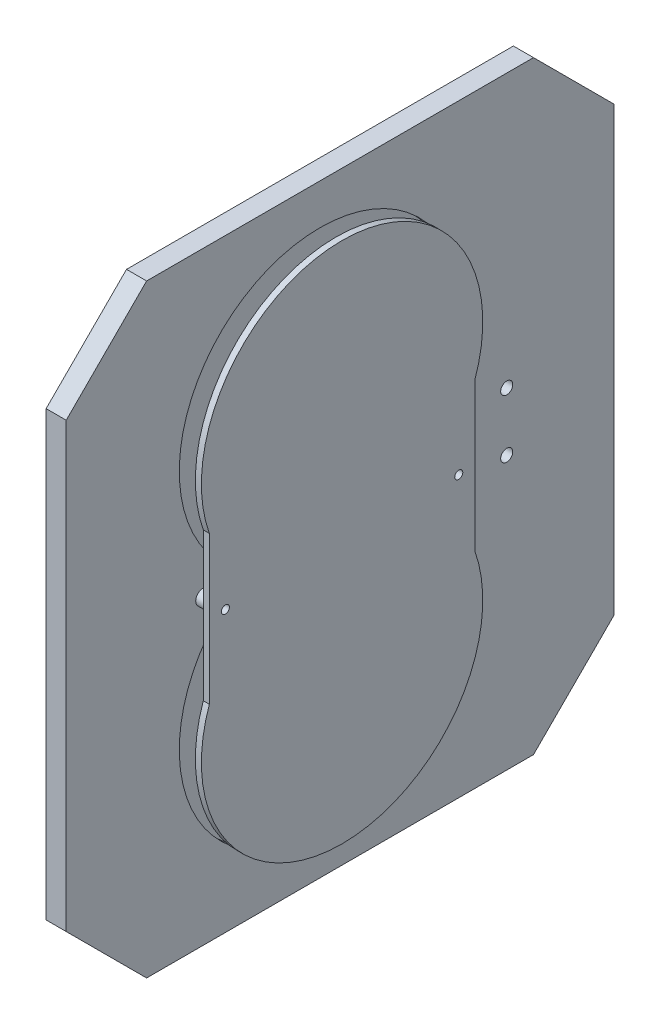
ISO-10303-21;
HEADER;
FILE_DESCRIPTION(('STEP AP214'),'2;1');
FILE_NAME('part.step','',(''),(''),'','','');
FILE_SCHEMA(('AUTOMOTIVE_DESIGN { 1 0 10303 214 1 1 1 1 }'));
ENDSEC;
DATA;
#1=APPLICATION_CONTEXT('core data for automotive mechanical design processes');
#2=APPLICATION_PROTOCOL_DEFINITION('international standard','automotive_design',2000,#1);
#3=PRODUCT_CONTEXT('',#1,'mechanical');
#4=PRODUCT('Part','Part','',(#3));
#5=PRODUCT_RELATED_PRODUCT_CATEGORY('part','',(#4));
#6=PRODUCT_DEFINITION_FORMATION('','',#4);
#7=PRODUCT_DEFINITION_CONTEXT('part definition',#1,'design');
#8=PRODUCT_DEFINITION('design','',#6,#7);
#9=PRODUCT_DEFINITION_SHAPE('','',#8);
#10=(LENGTH_UNIT() NAMED_UNIT(*) SI_UNIT(.MILLI.,.METRE.));
#11=(NAMED_UNIT(*) PLANE_ANGLE_UNIT() SI_UNIT($,.RADIAN.));
#12=(NAMED_UNIT(*) SI_UNIT($,.STERADIAN.) SOLID_ANGLE_UNIT());
#13=UNCERTAINTY_MEASURE_WITH_UNIT(LENGTH_MEASURE(1.E-05),#10,'distance_accuracy_value','');
#14=(GEOMETRIC_REPRESENTATION_CONTEXT(3) GLOBAL_UNCERTAINTY_ASSIGNED_CONTEXT((#13)) GLOBAL_UNIT_ASSIGNED_CONTEXT((#10,
#11,#12)) REPRESENTATION_CONTEXT('',''));
#15=CARTESIAN_POINT('',(0.,0.,0.));
#16=DIRECTION('',(0.,0.,1.));
#17=DIRECTION('',(1.,0.,0.));
#18=AXIS2_PLACEMENT_3D('',#15,#16,#17);
#19=CARTESIAN_POINT('',(4.,-2.74506344470263,57.0969516069964));
#20=DIRECTION('',(-1.,0.,0.));
#21=DIRECTION('',(0.,0.,1.));
#22=AXIS2_PLACEMENT_3D('',#19,#20,#21);
#23=CYLINDRICAL_SURFACE('',#22,2.00000000000005);
#24=DIRECTION('',(-1.,0.,0.));
#25=VECTOR('',#24,1.);
#26=CARTESIAN_POINT('',(4.,-4.21830325850244,55.744337674259));
#27=LINE('',#26,#25);
#28=CARTESIAN_POINT('',(4.,-4.21830325850244,55.744337674259));
#29=VERTEX_POINT('',#28);
#30=CARTESIAN_POINT('',(2.,-4.21830325850249,55.7443376742591));
#31=VERTEX_POINT('',#30);
#32=EDGE_CURVE('E345',#29,#31,#27,.T.);
#33=ORIENTED_EDGE('',*,*,#32,.T.);
#34=CARTESIAN_POINT('',(2.,-2.74506344470263,57.0969516069964));
#35=DIRECTION('',(-1.,0.,0.));
#36=DIRECTION('',(0.,0.,1.));
#37=AXIS2_PLACEMENT_3D('',#34,#35,#36);
#38=CIRCLE('',#37,1.99999999999999);
#39=CARTESIAN_POINT('',(2.,-2.74506344470263,55.0969516069964));
#40=VERTEX_POINT('',#39);
#41=EDGE_CURVE('E238',#40,#31,#38,.T.);
#42=ORIENTED_EDGE('',*,*,#41,.F.);
#43=DIRECTION('',(-1.,0.,0.));
#44=VECTOR('',#43,1.);
#45=CARTESIAN_POINT('',(4.,-2.74506344470259,55.0969516069963));
#46=LINE('',#45,#44);
#47=CARTESIAN_POINT('',(4.,-2.74506344470259,55.0969516069963));
#48=VERTEX_POINT('',#47);
#49=EDGE_CURVE('E324',#48,#40,#46,.T.);
#50=ORIENTED_EDGE('',*,*,#49,.F.);
#51=CARTESIAN_POINT('',(4.,-2.74506344470263,57.0969516069964));
#52=DIRECTION('',(-1.,0.,0.));
#53=DIRECTION('',(0.,0.,1.));
#54=AXIS2_PLACEMENT_3D('',#51,#52,#53);
#55=CIRCLE('',#54,2.00000000000005);
#56=EDGE_CURVE('E307',#48,#29,#55,.T.);
#57=ORIENTED_EDGE('',*,*,#56,.T.);
#58=EDGE_LOOP('',(#33,#42,#50,#57));
#59=FACE_BOUND('',#58,.T.);
#60=ADVANCED_FACE('F39',(#59),#23,.T.);
#61=CARTESIAN_POINT('',(4.,-30.,32.073593851357));
#62=DIRECTION('',(-1.,0.,0.));
#63=DIRECTION('',(0.,0.,1.));
#64=AXIS2_PLACEMENT_3D('',#61,#62,#63);
#65=CYLINDRICAL_SURFACE('',#64,35.);
#66=DIRECTION('',(-1.,0.,0.));
#67=VECTOR('',#66,1.);
#68=CARTESIAN_POINT('',(4.,-4.22212405309948,8.39868917010842));
#69=LINE('',#68,#67);
#70=CARTESIAN_POINT('',(4.,-4.22212405309948,8.39868917010842));
#71=VERTEX_POINT('',#70);
#72=CARTESIAN_POINT('',(2.,-4.22212405309948,8.39868917010843));
#73=VERTEX_POINT('',#72);
#74=EDGE_CURVE('E342',#71,#73,#69,.T.);
#75=ORIENTED_EDGE('',*,*,#74,.T.);
#76=CARTESIAN_POINT('',(2.,-30.,32.073593851357));
#77=DIRECTION('',(1.,0.,0.));
#78=DIRECTION('',(0.,0.,-1.));
#79=AXIS2_PLACEMENT_3D('',#76,#77,#78);
#80=CIRCLE('',#79,35.);
#81=EDGE_CURVE('E240',#31,#73,#80,.T.);
#82=ORIENTED_EDGE('',*,*,#81,.F.);
#83=ORIENTED_EDGE('',*,*,#32,.F.);
#84=CARTESIAN_POINT('',(4.,-30.,32.073593851357));
#85=DIRECTION('',(1.,0.,0.));
#86=DIRECTION('',(0.,0.,-1.));
#87=AXIS2_PLACEMENT_3D('',#84,#85,#86);
#88=CIRCLE('',#87,35.);
#89=EDGE_CURVE('E309',#29,#71,#88,.T.);
#90=ORIENTED_EDGE('',*,*,#89,.T.);
#91=EDGE_LOOP('',(#75,#82,#83,#90));
#92=FACE_BOUND('',#91,.T.);
#93=ADVANCED_FACE('F411',(#92),#65,.F.);
#94=CARTESIAN_POINT('',(4.,-2.74910257041943,7.04583747403708));
#95=DIRECTION('',(-1.,0.,0.));
#96=DIRECTION('',(0.,0.,1.));
#97=AXIS2_PLACEMENT_3D('',#94,#95,#96);
#98=CYLINDRICAL_SURFACE('',#97,2.);
#99=DIRECTION('',(-1.,0.,0.));
#100=VECTOR('',#99,1.);
#101=CARTESIAN_POINT('',(4.,-2.74910257041945,9.04583747403708));
#102=LINE('',#101,#100);
#103=CARTESIAN_POINT('',(4.,-2.74910257041945,9.04583747403708));
#104=VERTEX_POINT('',#103);
#105=CARTESIAN_POINT('',(2.,-2.74910257041945,9.04583747403709));
#106=VERTEX_POINT('',#105);
#107=EDGE_CURVE('E339',#104,#106,#102,.T.);
#108=ORIENTED_EDGE('',*,*,#107,.T.);
#109=CARTESIAN_POINT('',(2.,-2.74910257041945,7.04583747403708));
#110=DIRECTION('',(-1.,0.,0.));
#111=DIRECTION('',(0.,0.,-1.));
#112=AXIS2_PLACEMENT_3D('',#109,#110,#111);
#113=CIRCLE('',#112,2.);
#114=EDGE_CURVE('E242',#73,#106,#113,.T.);
#115=ORIENTED_EDGE('',*,*,#114,.F.);
#116=ORIENTED_EDGE('',*,*,#74,.F.);
#117=CARTESIAN_POINT('',(4.,-2.74910257041943,7.04583747403708));
#118=DIRECTION('',(-1.,0.,0.));
#119=DIRECTION('',(0.,0.,-1.));
#120=AXIS2_PLACEMENT_3D('',#117,#118,#119);
#121=CIRCLE('',#120,2.);
#122=EDGE_CURVE('E311',#71,#104,#121,.T.);
#123=ORIENTED_EDGE('',*,*,#122,.T.);
#124=EDGE_LOOP('',(#108,#115,#116,#123));
#125=FACE_BOUND('',#124,.T.);
#126=ADVANCED_FACE('F418',(#125),#98,.T.);
#127=CARTESIAN_POINT('',(4.,0.,9.04583747403709));
#128=DIRECTION('',(0.,0.,1.));
#129=DIRECTION('',(1.,0.,0.));
#130=AXIS2_PLACEMENT_3D('',#127,#128,#129);
#131=PLANE('',#130);
#132=DIRECTION('',(-1.,0.,0.));
#133=VECTOR('',#132,1.);
#134=CARTESIAN_POINT('',(4.,2.74910257041942,9.04583747403709));
#135=LINE('',#134,#133);
#136=CARTESIAN_POINT('',(4.,2.74910257041942,9.04583747403709));
#137=VERTEX_POINT('',#136);
#138=CARTESIAN_POINT('',(2.,2.74910257041942,9.04583747403709));
#139=VERTEX_POINT('',#138);
#140=EDGE_CURVE('E336',#137,#139,#135,.T.);
#141=ORIENTED_EDGE('',*,*,#140,.T.);
#142=DIRECTION('',(0.,1.,0.));
#143=VECTOR('',#142,1.);
#144=CARTESIAN_POINT('',(2.,0.,9.04583747403709));
#145=LINE('',#144,#143);
#146=EDGE_CURVE('E244',#106,#139,#145,.T.);
#147=ORIENTED_EDGE('',*,*,#146,.F.);
#148=ORIENTED_EDGE('',*,*,#107,.F.);
#149=DIRECTION('',(0.,1.,0.));
#150=VECTOR('',#149,1.);
#151=CARTESIAN_POINT('',(4.,0.,9.04583747403709));
#152=LINE('',#151,#150);
#153=EDGE_CURVE('E313',#104,#137,#152,.T.);
#154=ORIENTED_EDGE('',*,*,#153,.T.);
#155=EDGE_LOOP('',(#141,#147,#148,#154));
#156=FACE_BOUND('',#155,.T.);
#157=ADVANCED_FACE('F668',(#156),#131,.T.);
#158=CARTESIAN_POINT('',(4.,2.74910257041942,7.04583747403708));
#159=DIRECTION('',(-1.,0.,0.));
#160=DIRECTION('',(0.,0.,1.));
#161=AXIS2_PLACEMENT_3D('',#158,#159,#160);
#162=CYLINDRICAL_SURFACE('',#161,2.00000000000001);
#163=DIRECTION('',(-1.,0.,0.));
#164=VECTOR('',#163,1.);
#165=CARTESIAN_POINT('',(4.,4.22212405309945,8.39868917010844));
#166=LINE('',#165,#164);
#167=CARTESIAN_POINT('',(4.,4.22212405309945,8.39868917010844));
#168=VERTEX_POINT('',#167);
#169=CARTESIAN_POINT('',(2.,4.22212405309945,8.39868917010844));
#170=VERTEX_POINT('',#169);
#171=EDGE_CURVE('E333',#168,#170,#166,.T.);
#172=ORIENTED_EDGE('',*,*,#171,.T.);
#173=CARTESIAN_POINT('',(2.,2.74910257041942,7.04583747403708));
#174=DIRECTION('',(-1.,0.,0.));
#175=DIRECTION('',(0.,0.,1.));
#176=AXIS2_PLACEMENT_3D('',#173,#174,#175);
#177=CIRCLE('',#176,2.00000000000001);
#178=EDGE_CURVE('E223',#139,#170,#177,.T.);
#179=ORIENTED_EDGE('',*,*,#178,.F.);
#180=ORIENTED_EDGE('',*,*,#140,.F.);
#181=CARTESIAN_POINT('',(4.,2.74910257041942,7.04583747403708));
#182=DIRECTION('',(-1.,0.,0.));
#183=DIRECTION('',(0.,0.,1.));
#184=AXIS2_PLACEMENT_3D('',#181,#182,#183);
#185=CIRCLE('',#184,2.00000000000001);
#186=EDGE_CURVE('E315',#137,#168,#185,.T.);
#187=ORIENTED_EDGE('',*,*,#186,.T.);
#188=EDGE_LOOP('',(#172,#179,#180,#187));
#189=FACE_BOUND('',#188,.T.);
#190=ADVANCED_FACE('F660',(#189),#162,.T.);
#191=CARTESIAN_POINT('',(4.,30.,32.073593851357));
#192=DIRECTION('',(-1.,0.,0.));
#193=DIRECTION('',(0.,0.,1.));
#194=AXIS2_PLACEMENT_3D('',#191,#192,#193);
#195=CYLINDRICAL_SURFACE('',#194,35.);
#196=DIRECTION('',(-1.,0.,0.));
#197=VECTOR('',#196,1.);
#198=CARTESIAN_POINT('',(4.,4.21830325850246,55.7443376742591));
#199=LINE('',#198,#197);
#200=CARTESIAN_POINT('',(4.,4.21830325850246,55.7443376742591));
#201=VERTEX_POINT('',#200);
#202=CARTESIAN_POINT('',(2.,4.21830325850246,55.7443376742591));
#203=VERTEX_POINT('',#202);
#204=EDGE_CURVE('E330',#201,#203,#199,.T.);
#205=ORIENTED_EDGE('',*,*,#204,.T.);
#206=CARTESIAN_POINT('',(2.,30.,32.073593851357));
#207=DIRECTION('',(1.,0.,0.));
#208=DIRECTION('',(0.,0.,-1.));
#209=AXIS2_PLACEMENT_3D('',#206,#207,#208);
#210=CIRCLE('',#209,35.);
#211=EDGE_CURVE('E233',#170,#203,#210,.T.);
#212=ORIENTED_EDGE('',*,*,#211,.F.);
#213=ORIENTED_EDGE('',*,*,#171,.F.);
#214=CARTESIAN_POINT('',(4.,30.,32.073593851357));
#215=DIRECTION('',(1.,0.,0.));
#216=DIRECTION('',(0.,0.,-1.));
#217=AXIS2_PLACEMENT_3D('',#214,#215,#216);
#218=CIRCLE('',#217,35.);
#219=EDGE_CURVE('E317',#168,#201,#218,.T.);
#220=ORIENTED_EDGE('',*,*,#219,.T.);
#221=EDGE_LOOP('',(#205,#212,#213,#220));
#222=FACE_BOUND('',#221,.T.);
#223=ADVANCED_FACE('F652',(#222),#195,.F.);
#224=CARTESIAN_POINT('',(4.,2.7450634447026,57.0969516069964));
#225=DIRECTION('',(-1.,0.,0.));
#226=DIRECTION('',(0.,0.,1.));
#227=AXIS2_PLACEMENT_3D('',#224,#225,#226);
#228=CYLINDRICAL_SURFACE('',#227,2.00000000000001);
#229=DIRECTION('',(-1.,0.,0.));
#230=VECTOR('',#229,1.);
#231=CARTESIAN_POINT('',(4.,2.7450634447026,55.0969516069964));
#232=LINE('',#231,#230);
#233=CARTESIAN_POINT('',(4.,2.7450634447026,55.0969516069964));
#234=VERTEX_POINT('',#233);
#235=CARTESIAN_POINT('',(2.,2.7450634447026,55.0969516069964));
#236=VERTEX_POINT('',#235);
#237=EDGE_CURVE('E327',#234,#236,#232,.T.);
#238=ORIENTED_EDGE('',*,*,#237,.T.);
#239=CARTESIAN_POINT('',(2.,2.7450634447026,57.0969516069964));
#240=DIRECTION('',(-1.,0.,0.));
#241=DIRECTION('',(0.,0.,-1.));
#242=AXIS2_PLACEMENT_3D('',#239,#240,#241);
#243=CIRCLE('',#242,2.00000000000001);
#244=EDGE_CURVE('E54',#203,#236,#243,.T.);
#245=ORIENTED_EDGE('',*,*,#244,.F.);
#246=ORIENTED_EDGE('',*,*,#204,.F.);
#247=CARTESIAN_POINT('',(4.,2.7450634447026,57.0969516069964));
#248=DIRECTION('',(-1.,0.,0.));
#249=DIRECTION('',(0.,0.,-1.));
#250=AXIS2_PLACEMENT_3D('',#247,#248,#249);
#251=CIRCLE('',#250,2.00000000000001);
#252=EDGE_CURVE('E319',#201,#234,#251,.T.);
#253=ORIENTED_EDGE('',*,*,#252,.T.);
#254=EDGE_LOOP('',(#238,#245,#246,#253));
#255=FACE_BOUND('',#254,.T.);
#256=ADVANCED_FACE('F644',(#255),#228,.T.);
#257=CARTESIAN_POINT('',(4.,0.,55.0969516069964));
#258=DIRECTION('',(0.,0.,-1.));
#259=DIRECTION('',(0.,1.,0.));
#260=AXIS2_PLACEMENT_3D('',#257,#258,#259);
#261=PLANE('',#260);
#262=ORIENTED_EDGE('',*,*,#49,.T.);
#263=DIRECTION('',(0.,-1.,0.));
#264=VECTOR('',#263,1.);
#265=CARTESIAN_POINT('',(2.,0.,55.0969516069964));
#266=LINE('',#265,#264);
#267=EDGE_CURVE('E236',#236,#40,#266,.T.);
#268=ORIENTED_EDGE('',*,*,#267,.F.);
#269=ORIENTED_EDGE('',*,*,#237,.F.);
#270=DIRECTION('',(0.,-1.,0.));
#271=VECTOR('',#270,1.);
#272=CARTESIAN_POINT('',(4.,0.,55.0969516069964));
#273=LINE('',#272,#271);
#274=EDGE_CURVE('E322',#234,#48,#273,.T.);
#275=ORIENTED_EDGE('',*,*,#274,.T.);
#276=EDGE_LOOP('',(#262,#268,#269,#275));
#277=FACE_BOUND('',#276,.T.);
#278=ADVANCED_FACE('F367',(#277),#261,.T.);
#279=CARTESIAN_POINT('',(4.,0.,0.));
#280=DIRECTION('',(-1.,0.,0.));
#281=DIRECTION('',(0.,0.,1.));
#282=AXIS2_PLACEMENT_3D('',#279,#280,#281);
#283=PLANE('',#282);
#284=CARTESIAN_POINT('',(4.,0.,3.04583747403708));
#285=DIRECTION('',(-1.,0.,0.));
#286=DIRECTION('',(0.,0.,1.));
#287=AXIS2_PLACEMENT_3D('',#284,#285,#286);
#288=CIRCLE('',#287,2.);
#289=CARTESIAN_POINT('',(4.,0.,5.04583747403708));
#290=VERTEX_POINT('',#289);
#291=EDGE_CURVE('E11',#290,#290,#288,.F.);
#292=ORIENTED_EDGE('',*,*,#291,.F.);
#293=EDGE_LOOP('',(#292));
#294=FACE_BOUND('',#293,.T.);
#295=CARTESIAN_POINT('',(4.,0.,61.0969516069964));
#296=DIRECTION('',(-1.,0.,0.));
#297=DIRECTION('',(0.,0.,1.));
#298=AXIS2_PLACEMENT_3D('',#295,#296,#297);
#299=CIRCLE('',#298,1.88658954608714);
#300=CARTESIAN_POINT('',(4.,0.,62.9835411530835));
#301=VERTEX_POINT('',#300);
#302=EDGE_CURVE('E47',#301,#301,#299,.F.);
#303=ORIENTED_EDGE('',*,*,#302,.F.);
#304=EDGE_LOOP('',(#303));
#305=FACE_BOUND('',#304,.T.);
#306=DIRECTION('',(0.,0.,-1.));
#307=VECTOR('',#306,1.);
#308=CARTESIAN_POINT('',(4.,-75.0865928546104,95.1990293138328));
#309=LINE('',#308,#307);
#310=CARTESIAN_POINT('',(4.,-75.0865928546104,75.1990293138328));
#311=VERTEX_POINT('',#310);
#312=CARTESIAN_POINT('',(4.,-75.0865928546104,-21.0433816899386));
#313=VERTEX_POINT('',#312);
#314=EDGE_CURVE('E348',#311,#313,#309,.T.);
#315=ORIENTED_EDGE('',*,*,#314,.T.);
#316=DIRECTION('',(0.,-0.707106781186548,0.707106781186547));
#317=VECTOR('',#316,1.);
#318=CARTESIAN_POINT('',(4.,-55.0865928546104,-41.0433816899386));
#319=LINE('',#318,#317);
#320=CARTESIAN_POINT('',(4.,-55.0865928546104,-41.0433816899386));
#321=VERTEX_POINT('',#320);
#322=EDGE_CURVE('E263',#321,#313,#319,.T.);
#323=ORIENTED_EDGE('',*,*,#322,.F.);
#324=DIRECTION('',(0.,1.,0.));
#325=VECTOR('',#324,1.);
#326=CARTESIAN_POINT('',(4.,75.0865928546104,-41.0433816899386));
#327=LINE('',#326,#325);
#328=CARTESIAN_POINT('',(4.,55.0865928546104,-41.0433816899386));
#329=VERTEX_POINT('',#328);
#330=EDGE_CURVE('E351',#321,#329,#327,.T.);
#331=ORIENTED_EDGE('',*,*,#330,.T.);
#332=DIRECTION('',(0.,-0.707106781186548,-0.707106781186547));
#333=VECTOR('',#332,1.);
#334=CARTESIAN_POINT('',(4.,55.0865928546104,-41.0433816899386));
#335=LINE('',#334,#333);
#336=CARTESIAN_POINT('',(4.,75.0865928546104,-21.0433816899386));
#337=VERTEX_POINT('',#336);
#338=EDGE_CURVE('E253',#337,#329,#335,.T.);
#339=ORIENTED_EDGE('',*,*,#338,.F.);
#340=DIRECTION('',(0.,0.,1.));
#341=VECTOR('',#340,1.);
#342=CARTESIAN_POINT('',(4.,75.0865928546104,75.0007246008818));
#343=LINE('',#342,#341);
#344=CARTESIAN_POINT('',(4.,75.0865928546104,75.1990293138328));
#345=VERTEX_POINT('',#344);
#346=EDGE_CURVE('E354',#337,#345,#343,.T.);
#347=ORIENTED_EDGE('',*,*,#346,.T.);
#348=DIRECTION('',(0.,0.707106781186548,-0.707106781186548));
#349=VECTOR('',#348,1.);
#350=CARTESIAN_POINT('',(4.,55.0865928546104,95.1990293138328));
#351=LINE('',#350,#349);
#352=CARTESIAN_POINT('',(4.,55.0865928546104,95.1990293138328));
#353=VERTEX_POINT('',#352);
#354=EDGE_CURVE('E254',#353,#345,#351,.T.);
#355=ORIENTED_EDGE('',*,*,#354,.F.);
#356=DIRECTION('',(0.,-1.,0.));
#357=VECTOR('',#356,1.);
#358=CARTESIAN_POINT('',(4.,75.0865928546104,95.1990293138328));
#359=LINE('',#358,#357);
#360=CARTESIAN_POINT('',(4.,-55.0865928546104,95.1990293138328));
#361=VERTEX_POINT('',#360);
#362=EDGE_CURVE('E357',#353,#361,#359,.T.);
#363=ORIENTED_EDGE('',*,*,#362,.T.);
#364=DIRECTION('',(0.,0.707106781186548,0.707106781186547));
#365=VECTOR('',#364,1.);
#366=CARTESIAN_POINT('',(4.,-55.0865928546104,95.1990293138328));
#367=LINE('',#366,#365);
#368=EDGE_CURVE('E256',#311,#361,#367,.T.);
#369=ORIENTED_EDGE('',*,*,#368,.F.);
#370=EDGE_LOOP('',(#315,#323,#331,#339,#347,#355,#363,#369));
#371=FACE_BOUND('',#370,.T.);
#372=ORIENTED_EDGE('',*,*,#56,.F.);
#373=ORIENTED_EDGE('',*,*,#274,.F.);
#374=ORIENTED_EDGE('',*,*,#252,.F.);
#375=ORIENTED_EDGE('',*,*,#219,.F.);
#376=ORIENTED_EDGE('',*,*,#186,.F.);
#377=ORIENTED_EDGE('',*,*,#153,.F.);
#378=ORIENTED_EDGE('',*,*,#122,.F.);
#379=ORIENTED_EDGE('',*,*,#89,.F.);
#380=EDGE_LOOP('',(#372,#373,#374,#375,#376,#377,#378,#379));
#381=FACE_BOUND('',#380,.T.);
#382=CARTESIAN_POINT('',(4.,7.24761685,-14.384168298643));
#383=DIRECTION('',(1.,0.,0.));
#384=DIRECTION('',(0.,0.,-1.));
#385=AXIS2_PLACEMENT_3D('',#382,#383,#384);
#386=CIRCLE('',#385,1.5);
#387=CARTESIAN_POINT('',(4.,7.24761685,-15.884168298643));
#388=VERTEX_POINT('',#387);
#389=EDGE_CURVE('E304',#388,#388,#386,.T.);
#390=ORIENTED_EDGE('',*,*,#389,.F.);
#391=EDGE_LOOP('',(#390));
#392=FACE_BOUND('',#391,.T.);
#393=CARTESIAN_POINT('',(4.,-7.24761685000001,-14.384168298643));
#394=DIRECTION('',(1.,0.,0.));
#395=DIRECTION('',(0.,0.,-1.));
#396=AXIS2_PLACEMENT_3D('',#393,#394,#395);
#397=CIRCLE('',#396,1.5);
#398=CARTESIAN_POINT('',(4.,-7.24761685000001,-15.884168298643));
#399=VERTEX_POINT('',#398);
#400=EDGE_CURVE('E301',#399,#399,#397,.T.);
#401=ORIENTED_EDGE('',*,*,#400,.F.);
#402=EDGE_LOOP('',(#401));
#403=FACE_BOUND('',#402,.T.);
#404=ADVANCED_FACE('F364',(#294,#305,#371,#381,#392,#403),#283,.F.);
#405=CARTESIAN_POINT('',(4.,-75.0865928546104,75.0007246008818));
#406=DIRECTION('',(0.,1.,0.));
#407=DIRECTION('',(0.,0.,1.));
#408=AXIS2_PLACEMENT_3D('',#405,#406,#407);
#409=PLANE('',#408);
#410=DIRECTION('',(0.,0.,-1.));
#411=VECTOR('',#410,1.);
#412=CARTESIAN_POINT('',(-0.999999999999994,-75.0865928546104,95.1990293138328));
#413=LINE('',#412,#411);
#414=CARTESIAN_POINT('',(-0.999999999999994,-75.0865928546104,75.1990293138328));
#415=VERTEX_POINT('',#414);
#416=CARTESIAN_POINT('',(-0.999999999999994,-75.0865928546104,-21.0433816899386));
#417=VERTEX_POINT('',#416);
#418=EDGE_CURVE('E289',#415,#417,#413,.T.);
#419=ORIENTED_EDGE('',*,*,#418,.T.);
#420=DIRECTION('',(1.,0.,0.));
#421=VECTOR('',#420,1.);
#422=CARTESIAN_POINT('',(-0.999999999999994,-75.0865928546104,-21.0433816899386));
#423=LINE('',#422,#421);
#424=EDGE_CURVE('E246',#417,#313,#423,.T.);
#425=ORIENTED_EDGE('',*,*,#424,.T.);
#426=ORIENTED_EDGE('',*,*,#314,.F.);
#427=DIRECTION('',(1.,0.,0.));
#428=VECTOR('',#427,1.);
#429=CARTESIAN_POINT('',(-0.999999999999994,-75.0865928546104,75.1990293138328));
#430=LINE('',#429,#428);
#431=EDGE_CURVE('E279',#415,#311,#430,.T.);
#432=ORIENTED_EDGE('',*,*,#431,.F.);
#433=EDGE_LOOP('',(#419,#425,#426,#432));
#434=FACE_BOUND('',#433,.T.);
#435=ADVANCED_FACE('F41',(#434),#409,.F.);
#436=CARTESIAN_POINT('',(4.,75.0865928546104,-41.0433816899386));
#437=DIRECTION('',(0.,0.,1.));
#438=DIRECTION('',(1.,0.,0.));
#439=AXIS2_PLACEMENT_3D('',#436,#437,#438);
#440=PLANE('',#439);
#441=ORIENTED_EDGE('',*,*,#330,.F.);
#442=DIRECTION('',(1.,0.,0.));
#443=VECTOR('',#442,1.);
#444=CARTESIAN_POINT('',(-0.999999999999994,-55.0865928546104,-41.0433816899386));
#445=LINE('',#444,#443);
#446=CARTESIAN_POINT('',(-0.999999999999994,-55.0865928546104,-41.0433816899386));
#447=VERTEX_POINT('',#446);
#448=EDGE_CURVE('E266',#447,#321,#445,.T.);
#449=ORIENTED_EDGE('',*,*,#448,.F.);
#450=DIRECTION('',(0.,1.,0.));
#451=VECTOR('',#450,1.);
#452=CARTESIAN_POINT('',(-0.999999999999994,75.0865928546104,-41.0433816899386));
#453=LINE('',#452,#451);
#454=CARTESIAN_POINT('',(-0.999999999999994,55.0865928546104,-41.0433816899386));
#455=VERTEX_POINT('',#454);
#456=EDGE_CURVE('E292',#447,#455,#453,.T.);
#457=ORIENTED_EDGE('',*,*,#456,.T.);
#458=DIRECTION('',(1.,0.,0.));
#459=VECTOR('',#458,1.);
#460=CARTESIAN_POINT('',(-0.999999999999994,55.0865928546104,-41.0433816899386));
#461=LINE('',#460,#459);
#462=EDGE_CURVE('E62',#455,#329,#461,.T.);
#463=ORIENTED_EDGE('',*,*,#462,.T.);
#464=EDGE_LOOP('',(#441,#449,#457,#463));
#465=FACE_BOUND('',#464,.T.);
#466=ADVANCED_FACE('F424',(#465),#440,.F.);
#467=CARTESIAN_POINT('',(4.,75.0865928546104,75.0007246008818));
#468=DIRECTION('',(0.,-1.,0.));
#469=DIRECTION('',(0.,0.,-1.));
#470=AXIS2_PLACEMENT_3D('',#467,#468,#469);
#471=PLANE('',#470);
#472=ORIENTED_EDGE('',*,*,#346,.F.);
#473=DIRECTION('',(1.,0.,0.));
#474=VECTOR('',#473,1.);
#475=CARTESIAN_POINT('',(-0.999999999999994,75.0865928546104,-21.0433816899386));
#476=LINE('',#475,#474);
#477=CARTESIAN_POINT('',(-0.999999999999994,75.0865928546104,-21.0433816899386));
#478=VERTEX_POINT('',#477);
#479=EDGE_CURVE('E259',#478,#337,#476,.T.);
#480=ORIENTED_EDGE('',*,*,#479,.F.);
#481=DIRECTION('',(0.,0.,1.));
#482=VECTOR('',#481,1.);
#483=CARTESIAN_POINT('',(-0.999999999999994,75.0865928546104,75.0007246008818));
#484=LINE('',#483,#482);
#485=CARTESIAN_POINT('',(-0.999999999999994,75.0865928546104,75.1990293138328));
#486=VERTEX_POINT('',#485);
#487=EDGE_CURVE('E295',#478,#486,#484,.T.);
#488=ORIENTED_EDGE('',*,*,#487,.T.);
#489=DIRECTION('',(1.,0.,0.));
#490=VECTOR('',#489,1.);
#491=CARTESIAN_POINT('',(-0.999999999999994,75.0865928546104,75.1990293138328));
#492=LINE('',#491,#490);
#493=EDGE_CURVE('E247',#486,#345,#492,.T.);
#494=ORIENTED_EDGE('',*,*,#493,.T.);
#495=EDGE_LOOP('',(#472,#480,#488,#494));
#496=FACE_BOUND('',#495,.T.);
#497=ADVANCED_FACE('F406',(#496),#471,.F.);
#498=CARTESIAN_POINT('',(4.,75.0865928546104,95.1990293138328));
#499=DIRECTION('',(0.,0.,-1.));
#500=DIRECTION('',(-1.,0.,0.));
#501=AXIS2_PLACEMENT_3D('',#498,#499,#500);
#502=PLANE('',#501);
#503=ORIENTED_EDGE('',*,*,#362,.F.);
#504=DIRECTION('',(1.,0.,0.));
#505=VECTOR('',#504,1.);
#506=CARTESIAN_POINT('',(-0.999999999999994,55.0865928546104,95.1990293138328));
#507=LINE('',#506,#505);
#508=CARTESIAN_POINT('',(-0.999999999999994,55.0865928546104,95.1990293138328));
#509=VERTEX_POINT('',#508);
#510=EDGE_CURVE('E251',#509,#353,#507,.T.);
#511=ORIENTED_EDGE('',*,*,#510,.F.);
#512=DIRECTION('',(0.,-1.,0.));
#513=VECTOR('',#512,1.);
#514=CARTESIAN_POINT('',(-0.999999999999994,75.0865928546104,95.1990293138328));
#515=LINE('',#514,#513);
#516=CARTESIAN_POINT('',(-0.999999999999994,-55.0865928546104,95.1990293138328));
#517=VERTEX_POINT('',#516);
#518=EDGE_CURVE('E298',#509,#517,#515,.T.);
#519=ORIENTED_EDGE('',*,*,#518,.T.);
#520=DIRECTION('',(1.,0.,0.));
#521=VECTOR('',#520,1.);
#522=CARTESIAN_POINT('',(-0.999999999999994,-55.0865928546104,95.1990293138328));
#523=LINE('',#522,#521);
#524=EDGE_CURVE('E277',#517,#361,#523,.T.);
#525=ORIENTED_EDGE('',*,*,#524,.T.);
#526=EDGE_LOOP('',(#503,#511,#519,#525));
#527=FACE_BOUND('',#526,.T.);
#528=ADVANCED_FACE('F400',(#527),#502,.F.);
#529=CARTESIAN_POINT('',(4.,7.24761685,-14.384168298643));
#530=DIRECTION('',(-1.,0.,0.));
#531=DIRECTION('',(0.,0.,1.));
#532=AXIS2_PLACEMENT_3D('',#529,#530,#531);
#533=CYLINDRICAL_SURFACE('',#532,1.5);
#534=ORIENTED_EDGE('',*,*,#389,.T.);
#535=EDGE_LOOP('',(#534));
#536=FACE_BOUND('',#535,.T.);
#537=CARTESIAN_POINT('',(-0.999999999999994,7.24761685,-14.384168298643));
#538=DIRECTION('',(1.,0.,0.));
#539=DIRECTION('',(0.,0.,-1.));
#540=AXIS2_PLACEMENT_3D('',#537,#538,#539);
#541=CIRCLE('',#540,1.5);
#542=CARTESIAN_POINT('',(-0.999999999999994,7.24761685,-15.884168298643));
#543=VERTEX_POINT('',#542);
#544=EDGE_CURVE('E286',#543,#543,#541,.T.);
#545=ORIENTED_EDGE('',*,*,#544,.F.);
#546=EDGE_LOOP('',(#545));
#547=FACE_BOUND('',#546,.T.);
#548=ADVANCED_FACE('F388',(#536,#547),#533,.F.);
#549=CARTESIAN_POINT('',(4.,-7.24761685000001,-14.384168298643));
#550=DIRECTION('',(-1.,0.,0.));
#551=DIRECTION('',(0.,0.,1.));
#552=AXIS2_PLACEMENT_3D('',#549,#550,#551);
#553=CYLINDRICAL_SURFACE('',#552,1.5);
#554=ORIENTED_EDGE('',*,*,#400,.T.);
#555=EDGE_LOOP('',(#554));
#556=FACE_BOUND('',#555,.T.);
#557=CARTESIAN_POINT('',(-0.999999999999994,-7.24761685000001,-14.384168298643));
#558=DIRECTION('',(1.,0.,0.));
#559=DIRECTION('',(0.,0.,-1.));
#560=AXIS2_PLACEMENT_3D('',#557,#558,#559);
#561=CIRCLE('',#560,1.5);
#562=CARTESIAN_POINT('',(-0.999999999999994,-7.24761685000001,-15.884168298643));
#563=VERTEX_POINT('',#562);
#564=EDGE_CURVE('E281',#563,#563,#561,.T.);
#565=ORIENTED_EDGE('',*,*,#564,.F.);
#566=EDGE_LOOP('',(#565));
#567=FACE_BOUND('',#566,.T.);
#568=ADVANCED_FACE('F384',(#556,#567),#553,.F.);
#569=CARTESIAN_POINT('',(-0.999999999999994,0.,0.));
#570=DIRECTION('',(-1.,0.,0.));
#571=DIRECTION('',(0.,0.,1.));
#572=AXIS2_PLACEMENT_3D('',#569,#570,#571);
#573=PLANE('',#572);
#574=CARTESIAN_POINT('',(-1.,30.,32.073593851357));
#575=DIRECTION('',(1.,0.,0.));
#576=DIRECTION('',(0.,0.,-1.));
#577=AXIS2_PLACEMENT_3D('',#574,#575,#576);
#578=CIRCLE('',#577,9.);
#579=CARTESIAN_POINT('',(-1.,30.,23.073593851357));
#580=VERTEX_POINT('',#579);
#581=EDGE_CURVE('E220',#580,#580,#578,.T.);
#582=ORIENTED_EDGE('',*,*,#581,.T.);
#583=EDGE_LOOP('',(#582));
#584=FACE_BOUND('',#583,.T.);
#585=CARTESIAN_POINT('',(-1.,-30.,32.073593851357));
#586=DIRECTION('',(1.,0.,0.));
#587=DIRECTION('',(0.,0.,-1.));
#588=AXIS2_PLACEMENT_3D('',#585,#586,#587);
#589=CIRCLE('',#588,3.);
#590=CARTESIAN_POINT('',(-1.,-30.,29.073593851357));
#591=VERTEX_POINT('',#590);
#592=EDGE_CURVE('E219',#591,#591,#589,.T.);
#593=ORIENTED_EDGE('',*,*,#592,.T.);
#594=EDGE_LOOP('',(#593));
#595=FACE_BOUND('',#594,.T.);
#596=DIRECTION('',(0.,-0.707106781186548,0.707106781186547));
#597=VECTOR('',#596,1.);
#598=CARTESIAN_POINT('',(-0.999999999999994,-55.0865928546104,-41.0433816899386));
#599=LINE('',#598,#597);
#600=EDGE_CURVE('E268',#447,#417,#599,.T.);
#601=ORIENTED_EDGE('',*,*,#600,.T.);
#602=ORIENTED_EDGE('',*,*,#418,.F.);
#603=DIRECTION('',(0.,0.707106781186548,0.707106781186547));
#604=VECTOR('',#603,1.);
#605=CARTESIAN_POINT('',(-0.999999999999994,-55.0865928546104,95.1990293138328));
#606=LINE('',#605,#604);
#607=EDGE_CURVE('E274',#415,#517,#606,.T.);
#608=ORIENTED_EDGE('',*,*,#607,.T.);
#609=ORIENTED_EDGE('',*,*,#518,.F.);
#610=DIRECTION('',(0.,0.707106781186548,-0.707106781186548));
#611=VECTOR('',#610,1.);
#612=CARTESIAN_POINT('',(-0.999999999999994,55.0865928546104,95.1990293138328));
#613=LINE('',#612,#611);
#614=EDGE_CURVE('E250',#509,#486,#613,.T.);
#615=ORIENTED_EDGE('',*,*,#614,.T.);
#616=ORIENTED_EDGE('',*,*,#487,.F.);
#617=DIRECTION('',(0.,-0.707106781186548,-0.707106781186547));
#618=VECTOR('',#617,1.);
#619=CARTESIAN_POINT('',(-0.999999999999994,55.0865928546104,-41.0433816899386));
#620=LINE('',#619,#618);
#621=EDGE_CURVE('E261',#478,#455,#620,.T.);
#622=ORIENTED_EDGE('',*,*,#621,.T.);
#623=ORIENTED_EDGE('',*,*,#456,.F.);
#624=EDGE_LOOP('',(#601,#602,#608,#609,#615,#616,#622,#623));
#625=FACE_BOUND('',#624,.T.);
#626=ORIENTED_EDGE('',*,*,#564,.T.);
#627=EDGE_LOOP('',(#626));
#628=FACE_BOUND('',#627,.T.);
#629=ORIENTED_EDGE('',*,*,#544,.T.);
#630=EDGE_LOOP('',(#629));
#631=FACE_BOUND('',#630,.T.);
#632=ADVANCED_FACE('F387',(#584,#595,#625,#628,#631),#573,.T.);
#633=CARTESIAN_POINT('',(-0.999999999999994,-55.0865928546104,95.1990293138328));
#634=DIRECTION('',(0.,0.707106781186547,-0.707106781186548));
#635=DIRECTION('',(0.,0.707106781186548,0.707106781186547));
#636=AXIS2_PLACEMENT_3D('',#633,#634,#635);
#637=PLANE('',#636);
#638=ORIENTED_EDGE('',*,*,#368,.T.);
#639=ORIENTED_EDGE('',*,*,#524,.F.);
#640=ORIENTED_EDGE('',*,*,#607,.F.);
#641=ORIENTED_EDGE('',*,*,#431,.T.);
#642=EDGE_LOOP('',(#638,#639,#640,#641));
#643=FACE_BOUND('',#642,.T.);
#644=ADVANCED_FACE('F394',(#643),#637,.F.);
#645=CARTESIAN_POINT('',(-0.999999999999994,55.0865928546104,95.1990293138328));
#646=DIRECTION('',(0.,-0.707106781186548,-0.707106781186548));
#647=DIRECTION('',(0.,0.707106781186548,-0.707106781186548));
#648=AXIS2_PLACEMENT_3D('',#645,#646,#647);
#649=PLANE('',#648);
#650=ORIENTED_EDGE('',*,*,#354,.T.);
#651=ORIENTED_EDGE('',*,*,#493,.F.);
#652=ORIENTED_EDGE('',*,*,#614,.F.);
#653=ORIENTED_EDGE('',*,*,#510,.T.);
#654=EDGE_LOOP('',(#650,#651,#652,#653));
#655=FACE_BOUND('',#654,.T.);
#656=ADVANCED_FACE('F452',(#655),#649,.F.);
#657=CARTESIAN_POINT('',(-0.999999999999994,55.0865928546104,-41.0433816899386));
#658=DIRECTION('',(0.,-0.707106781186547,0.707106781186548));
#659=DIRECTION('',(0.,-0.707106781186548,-0.707106781186547));
#660=AXIS2_PLACEMENT_3D('',#657,#658,#659);
#661=PLANE('',#660);
#662=ORIENTED_EDGE('',*,*,#338,.T.);
#663=ORIENTED_EDGE('',*,*,#462,.F.);
#664=ORIENTED_EDGE('',*,*,#621,.F.);
#665=ORIENTED_EDGE('',*,*,#479,.T.);
#666=EDGE_LOOP('',(#662,#663,#664,#665));
#667=FACE_BOUND('',#666,.T.);
#668=ADVANCED_FACE('F445',(#667),#661,.F.);
#669=CARTESIAN_POINT('',(-0.999999999999994,-55.0865928546104,-41.0433816899386));
#670=DIRECTION('',(0.,0.707106781186547,0.707106781186548));
#671=DIRECTION('',(0.,-0.707106781186548,0.707106781186547));
#672=AXIS2_PLACEMENT_3D('',#669,#670,#671);
#673=PLANE('',#672);
#674=ORIENTED_EDGE('',*,*,#322,.T.);
#675=ORIENTED_EDGE('',*,*,#424,.F.);
#676=ORIENTED_EDGE('',*,*,#600,.F.);
#677=ORIENTED_EDGE('',*,*,#448,.T.);
#678=EDGE_LOOP('',(#674,#675,#676,#677));
#679=FACE_BOUND('',#678,.T.);
#680=ADVANCED_FACE('F438',(#679),#673,.F.);
#681=CARTESIAN_POINT('',(2.,2.74910257041942,7.04583747403708));
#682=DIRECTION('',(-1.,0.,0.));
#683=DIRECTION('',(0.,0.,1.));
#684=AXIS2_PLACEMENT_3D('',#681,#682,#683);
#685=PLANE('',#684);
#686=CARTESIAN_POINT('',(2.,30.,32.073593851357));
#687=DIRECTION('',(1.,0.,0.));
#688=DIRECTION('',(0.,0.,-1.));
#689=AXIS2_PLACEMENT_3D('',#686,#687,#688);
#690=CIRCLE('',#689,9.);
#691=CARTESIAN_POINT('',(2.,30.,23.073593851357));
#692=VERTEX_POINT('',#691);
#693=EDGE_CURVE('E224',#692,#692,#690,.T.);
#694=ORIENTED_EDGE('',*,*,#693,.F.);
#695=EDGE_LOOP('',(#694));
#696=FACE_BOUND('',#695,.T.);
#697=CARTESIAN_POINT('',(2.,-30.,32.073593851357));
#698=DIRECTION('',(1.,0.,0.));
#699=DIRECTION('',(0.,0.,-1.));
#700=AXIS2_PLACEMENT_3D('',#697,#698,#699);
#701=CIRCLE('',#700,3.);
#702=CARTESIAN_POINT('',(2.,-30.,29.073593851357));
#703=VERTEX_POINT('',#702);
#704=EDGE_CURVE('E227',#703,#703,#701,.T.);
#705=ORIENTED_EDGE('',*,*,#704,.F.);
#706=EDGE_LOOP('',(#705));
#707=FACE_BOUND('',#706,.T.);
#708=ORIENTED_EDGE('',*,*,#178,.T.);
#709=ORIENTED_EDGE('',*,*,#211,.T.);
#710=ORIENTED_EDGE('',*,*,#244,.T.);
#711=ORIENTED_EDGE('',*,*,#267,.T.);
#712=ORIENTED_EDGE('',*,*,#41,.T.);
#713=ORIENTED_EDGE('',*,*,#81,.T.);
#714=ORIENTED_EDGE('',*,*,#114,.T.);
#715=ORIENTED_EDGE('',*,*,#146,.T.);
#716=EDGE_LOOP('',(#708,#709,#710,#711,#712,#713,#714,#715));
#717=FACE_BOUND('',#716,.T.);
#718=ADVANCED_FACE('F460',(#696,#707,#717),#685,.F.);
#719=CARTESIAN_POINT('',(-1.,-30.,32.073593851357));
#720=DIRECTION('',(1.,0.,0.));
#721=DIRECTION('',(0.,0.,-1.));
#722=AXIS2_PLACEMENT_3D('',#719,#720,#721);
#723=CYLINDRICAL_SURFACE('',#722,3.);
#724=ORIENTED_EDGE('',*,*,#592,.F.);
#725=EDGE_LOOP('',(#724));
#726=FACE_BOUND('',#725,.T.);
#727=ORIENTED_EDGE('',*,*,#704,.T.);
#728=EDGE_LOOP('',(#727));
#729=FACE_BOUND('',#728,.T.);
#730=ADVANCED_FACE('F465',(#726,#729),#723,.F.);
#731=CARTESIAN_POINT('',(-1.,30.,32.073593851357));
#732=DIRECTION('',(1.,0.,0.));
#733=DIRECTION('',(0.,0.,-1.));
#734=AXIS2_PLACEMENT_3D('',#731,#732,#733);
#735=CYLINDRICAL_SURFACE('',#734,9.);
#736=ORIENTED_EDGE('',*,*,#581,.F.);
#737=EDGE_LOOP('',(#736));
#738=FACE_BOUND('',#737,.T.);
#739=ORIENTED_EDGE('',*,*,#693,.T.);
#740=EDGE_LOOP('',(#739));
#741=FACE_BOUND('',#740,.T.);
#742=ADVANCED_FACE('F469',(#738,#741),#735,.F.);
#743=CARTESIAN_POINT('',(8.,0.,61.0969516069964));
#744=DIRECTION('',(-1.,0.,0.));
#745=DIRECTION('',(0.,0.,1.));
#746=AXIS2_PLACEMENT_3D('',#743,#744,#745);
#747=CYLINDRICAL_SURFACE('',#746,1.88658954608714);
#748=CARTESIAN_POINT('',(8.,0.,61.0969516069964));
#749=DIRECTION('',(1.,0.,0.));
#750=DIRECTION('',(0.,0.,-1.));
#751=AXIS2_PLACEMENT_3D('',#748,#749,#750);
#752=CIRCLE('',#751,1.88658954608714);
#753=CARTESIAN_POINT('',(8.,0.,59.2103620609092));
#754=VERTEX_POINT('',#753);
#755=EDGE_CURVE('E216',#754,#754,#752,.T.);
#756=ORIENTED_EDGE('',*,*,#755,.F.);
#757=EDGE_LOOP('',(#756));
#758=FACE_BOUND('',#757,.T.);
#759=ORIENTED_EDGE('',*,*,#302,.T.);
#760=EDGE_LOOP('',(#759));
#761=FACE_BOUND('',#760,.T.);
#762=ADVANCED_FACE('F362',(#758,#761),#747,.T.);
#763=CARTESIAN_POINT('',(8.,0.,3.04583747403708));
#764=DIRECTION('',(-1.,0.,0.));
#765=DIRECTION('',(0.,0.,1.));
#766=AXIS2_PLACEMENT_3D('',#763,#764,#765);
#767=CYLINDRICAL_SURFACE('',#766,2.);
#768=CARTESIAN_POINT('',(8.,0.,3.04583747403708));
#769=DIRECTION('',(1.,0.,0.));
#770=DIRECTION('',(0.,0.,-1.));
#771=AXIS2_PLACEMENT_3D('',#768,#769,#770);
#772=CIRCLE('',#771,2.);
#773=CARTESIAN_POINT('',(8.,0.,1.04583747403708));
#774=VERTEX_POINT('',#773);
#775=EDGE_CURVE('E202',#774,#774,#772,.T.);
#776=ORIENTED_EDGE('',*,*,#775,.F.);
#777=EDGE_LOOP('',(#776));
#778=FACE_BOUND('',#777,.T.);
#779=ORIENTED_EDGE('',*,*,#291,.T.);
#780=EDGE_LOOP('',(#779));
#781=FACE_BOUND('',#780,.T.);
#782=ADVANCED_FACE('F476',(#778,#781),#767,.T.);
#783=CARTESIAN_POINT('',(9.5,-30.,32.073593851357));
#784=DIRECTION('',(1.,0.,0.));
#785=DIRECTION('',(0.,0.,-1.));
#786=AXIS2_PLACEMENT_3D('',#783,#784,#785);
#787=PLANE('',#786);
#788=CARTESIAN_POINT('',(9.5,0.,61.0969516069964));
#789=DIRECTION('',(1.,0.,0.));
#790=DIRECTION('',(0.,0.,-1.));
#791=AXIS2_PLACEMENT_3D('',#788,#789,#790);
#792=CIRCLE('',#791,0.999999999999998);
#793=CARTESIAN_POINT('',(9.5,0.,60.0969516069964));
#794=VERTEX_POINT('',#793);
#795=EDGE_CURVE('E512',#794,#794,#792,.T.);
#796=ORIENTED_EDGE('',*,*,#795,.F.);
#797=EDGE_LOOP('',(#796));
#798=FACE_BOUND('',#797,.T.);
#799=DIRECTION('',(0.,-1.,0.));
#800=VECTOR('',#799,1.);
#801=CARTESIAN_POINT('',(9.5,0.,65.0969516069964));
#802=LINE('',#801,#800);
#803=CARTESIAN_POINT('',(9.5,18.4044041747284,65.0969516069964));
#804=VERTEX_POINT('',#803);
#805=CARTESIAN_POINT('',(9.5,-18.4044041747284,65.0969516069964));
#806=VERTEX_POINT('',#805);
#807=EDGE_CURVE('E187',#804,#806,#802,.T.);
#808=ORIENTED_EDGE('',*,*,#807,.T.);
#809=CARTESIAN_POINT('',(9.5,-30.,32.073593851357));
#810=DIRECTION('',(1.,0.,0.));
#811=DIRECTION('',(0.,0.,-1.));
#812=AXIS2_PLACEMENT_3D('',#809,#810,#811);
#813=CIRCLE('',#812,35.);
#814=CARTESIAN_POINT('',(9.5,-18.4169387172302,-0.954162525962914));
#815=VERTEX_POINT('',#814);
#816=EDGE_CURVE('E176',#806,#815,#813,.T.);
#817=ORIENTED_EDGE('',*,*,#816,.T.);
#818=DIRECTION('',(0.,1.,0.));
#819=VECTOR('',#818,1.);
#820=CARTESIAN_POINT('',(9.5,0.,-0.954162525962915));
#821=LINE('',#820,#819);
#822=CARTESIAN_POINT('',(9.5,18.4169387172301,-0.954162525962907));
#823=VERTEX_POINT('',#822);
#824=EDGE_CURVE('E186',#815,#823,#821,.T.);
#825=ORIENTED_EDGE('',*,*,#824,.T.);
#826=CARTESIAN_POINT('',(9.5,30.,32.073593851357));
#827=DIRECTION('',(1.,0.,0.));
#828=DIRECTION('',(0.,0.,-1.));
#829=AXIS2_PLACEMENT_3D('',#826,#827,#828);
#830=CIRCLE('',#829,35.);
#831=EDGE_CURVE('E193',#823,#804,#830,.T.);
#832=ORIENTED_EDGE('',*,*,#831,.T.);
#833=EDGE_LOOP('',(#808,#817,#825,#832));
#834=FACE_BOUND('',#833,.T.);
#835=CARTESIAN_POINT('',(9.5,0.,3.04583747403708));
#836=DIRECTION('',(1.,0.,0.));
#837=DIRECTION('',(0.,0.,-1.));
#838=AXIS2_PLACEMENT_3D('',#835,#836,#837);
#839=CIRCLE('',#838,1.);
#840=CARTESIAN_POINT('',(9.5,0.,2.04583747403708));
#841=VERTEX_POINT('',#840);
#842=EDGE_CURVE('E515',#841,#841,#839,.T.);
#843=ORIENTED_EDGE('',*,*,#842,.F.);
#844=EDGE_LOOP('',(#843));
#845=FACE_BOUND('',#844,.T.);
#846=ADVANCED_FACE('F190',(#798,#834,#845),#787,.T.);
#847=CARTESIAN_POINT('',(8.,-30.,32.073593851357));
#848=DIRECTION('',(1.,0.,0.));
#849=DIRECTION('',(0.,0.,-1.));
#850=AXIS2_PLACEMENT_3D('',#847,#848,#849);
#851=PLANE('',#850);
#852=ORIENTED_EDGE('',*,*,#755,.T.);
#853=EDGE_LOOP('',(#852));
#854=FACE_BOUND('',#853,.T.);
#855=ORIENTED_EDGE('',*,*,#775,.T.);
#856=EDGE_LOOP('',(#855));
#857=FACE_BOUND('',#856,.T.);
#858=CARTESIAN_POINT('',(8.,-30.,32.073593851357));
#859=DIRECTION('',(1.,0.,0.));
#860=DIRECTION('',(0.,0.,-1.));
#861=AXIS2_PLACEMENT_3D('',#858,#859,#860);
#862=CIRCLE('',#861,35.);
#863=CARTESIAN_POINT('',(8.,-18.4044041747284,65.0969516069964));
#864=VERTEX_POINT('',#863);
#865=CARTESIAN_POINT('',(8.,-18.4169387172302,-0.954162525962914));
#866=VERTEX_POINT('',#865);
#867=EDGE_CURVE('E514',#864,#866,#862,.T.);
#868=ORIENTED_EDGE('',*,*,#867,.F.);
#869=DIRECTION('',(0.,-1.,0.));
#870=VECTOR('',#869,1.);
#871=CARTESIAN_POINT('',(8.,0.,65.0969516069964));
#872=LINE('',#871,#870);
#873=CARTESIAN_POINT('',(8.,18.4044041747284,65.0969516069964));
#874=VERTEX_POINT('',#873);
#875=EDGE_CURVE('E197',#874,#864,#872,.T.);
#876=ORIENTED_EDGE('',*,*,#875,.F.);
#877=CARTESIAN_POINT('',(8.,30.,32.073593851357));
#878=DIRECTION('',(1.,0.,0.));
#879=DIRECTION('',(0.,0.,-1.));
#880=AXIS2_PLACEMENT_3D('',#877,#878,#879);
#881=CIRCLE('',#880,35.);
#882=CARTESIAN_POINT('',(8.,18.4169387172301,-0.954162525962907));
#883=VERTEX_POINT('',#882);
#884=EDGE_CURVE('E526',#883,#874,#881,.T.);
#885=ORIENTED_EDGE('',*,*,#884,.F.);
#886=DIRECTION('',(0.,1.,0.));
#887=VECTOR('',#886,1.);
#888=CARTESIAN_POINT('',(8.,0.,-0.954162525962915));
#889=LINE('',#888,#887);
#890=EDGE_CURVE('E517',#866,#883,#889,.T.);
#891=ORIENTED_EDGE('',*,*,#890,.F.);
#892=EDGE_LOOP('',(#868,#876,#885,#891));
#893=FACE_BOUND('',#892,.T.);
#894=ADVANCED_FACE('F492',(#854,#857,#893),#851,.F.);
#895=CARTESIAN_POINT('',(9.5,-30.,32.073593851357));
#896=DIRECTION('',(-1.,0.,0.));
#897=DIRECTION('',(0.,0.,1.));
#898=AXIS2_PLACEMENT_3D('',#895,#896,#897);
#899=CYLINDRICAL_SURFACE('',#898,35.);
#900=ORIENTED_EDGE('',*,*,#867,.T.);
#901=DIRECTION('',(-1.,0.,0.));
#902=VECTOR('',#901,1.);
#903=CARTESIAN_POINT('',(9.5,-18.4169387172302,-0.954162525962914));
#904=LINE('',#903,#902);
#905=EDGE_CURVE('E183',#815,#866,#904,.T.);
#906=ORIENTED_EDGE('',*,*,#905,.F.);
#907=ORIENTED_EDGE('',*,*,#816,.F.);
#908=DIRECTION('',(-1.,0.,0.));
#909=VECTOR('',#908,1.);
#910=CARTESIAN_POINT('',(9.5,-18.4044041747284,65.0969516069964));
#911=LINE('',#910,#909);
#912=EDGE_CURVE('E181',#806,#864,#911,.T.);
#913=ORIENTED_EDGE('',*,*,#912,.T.);
#914=EDGE_LOOP('',(#900,#906,#907,#913));
#915=FACE_BOUND('',#914,.T.);
#916=ADVANCED_FACE('F179',(#915),#899,.T.);
#917=CARTESIAN_POINT('',(9.5,0.,-0.954162525962915));
#918=DIRECTION('',(0.,0.,1.));
#919=DIRECTION('',(0.,-1.,0.));
#920=AXIS2_PLACEMENT_3D('',#917,#918,#919);
#921=PLANE('',#920);
#922=ORIENTED_EDGE('',*,*,#890,.T.);
#923=DIRECTION('',(-1.,0.,0.));
#924=VECTOR('',#923,1.);
#925=CARTESIAN_POINT('',(9.5,18.4169387172301,-0.954162525962907));
#926=LINE('',#925,#924);
#927=EDGE_CURVE('E207',#823,#883,#926,.T.);
#928=ORIENTED_EDGE('',*,*,#927,.F.);
#929=ORIENTED_EDGE('',*,*,#824,.F.);
#930=ORIENTED_EDGE('',*,*,#905,.T.);
#931=EDGE_LOOP('',(#922,#928,#929,#930));
#932=FACE_BOUND('',#931,.T.);
#933=ADVANCED_FACE('F491',(#932),#921,.F.);
#934=CARTESIAN_POINT('',(9.5,30.,32.073593851357));
#935=DIRECTION('',(-1.,0.,0.));
#936=DIRECTION('',(0.,0.,1.));
#937=AXIS2_PLACEMENT_3D('',#934,#935,#936);
#938=CYLINDRICAL_SURFACE('',#937,35.);
#939=ORIENTED_EDGE('',*,*,#884,.T.);
#940=DIRECTION('',(-1.,0.,0.));
#941=VECTOR('',#940,1.);
#942=CARTESIAN_POINT('',(9.5,18.4044041747284,65.0969516069964));
#943=LINE('',#942,#941);
#944=EDGE_CURVE('E523',#804,#874,#943,.T.);
#945=ORIENTED_EDGE('',*,*,#944,.F.);
#946=ORIENTED_EDGE('',*,*,#831,.F.);
#947=ORIENTED_EDGE('',*,*,#927,.T.);
#948=EDGE_LOOP('',(#939,#945,#946,#947));
#949=FACE_BOUND('',#948,.T.);
#950=ADVANCED_FACE('F495',(#949),#938,.T.);
#951=CARTESIAN_POINT('',(9.5,0.,65.0969516069964));
#952=DIRECTION('',(0.,0.,-1.));
#953=DIRECTION('',(-1.,0.,0.));
#954=AXIS2_PLACEMENT_3D('',#951,#952,#953);
#955=PLANE('',#954);
#956=ORIENTED_EDGE('',*,*,#875,.T.);
#957=ORIENTED_EDGE('',*,*,#912,.F.);
#958=ORIENTED_EDGE('',*,*,#807,.F.);
#959=ORIENTED_EDGE('',*,*,#944,.T.);
#960=EDGE_LOOP('',(#956,#957,#958,#959));
#961=FACE_BOUND('',#960,.T.);
#962=ADVANCED_FACE('F199',(#961),#955,.F.);
#963=CARTESIAN_POINT('',(4.,0.,3.04583747403708));
#964=DIRECTION('',(1.,0.,0.));
#965=DIRECTION('',(0.,0.,-1.));
#966=AXIS2_PLACEMENT_3D('',#963,#964,#965);
#967=CIRCLE('',#966,1.);
#968=CARTESIAN_POINT('',(4.,0.,2.04583747403708));
#969=VERTEX_POINT('',#968);
#970=EDGE_CURVE('E205',#969,#969,#967,.T.);
#971=ORIENTED_EDGE('',*,*,#970,.T.);
#972=EDGE_LOOP('',(#971));
#973=FACE_BOUND('',#972,.T.);
#974=ADVANCED_FACE('F370',(#973),#283,.F.);
#975=CARTESIAN_POINT('',(8.,0.,3.04583747403708));
#976=DIRECTION('',(-1.,0.,0.));
#977=DIRECTION('',(0.,0.,1.));
#978=AXIS2_PLACEMENT_3D('',#975,#976,#977);
#979=CYLINDRICAL_SURFACE('',#978,1.);
#980=ORIENTED_EDGE('',*,*,#970,.F.);
#981=EDGE_LOOP('',(#980));
#982=FACE_BOUND('',#981,.T.);
#983=ORIENTED_EDGE('',*,*,#842,.T.);
#984=EDGE_LOOP('',(#983));
#985=FACE_BOUND('',#984,.T.);
#986=ADVANCED_FACE('F482',(#982,#985),#979,.F.);
#987=CARTESIAN_POINT('',(4.,0.,61.0969516069964));
#988=DIRECTION('',(1.,0.,0.));
#989=DIRECTION('',(0.,0.,-1.));
#990=AXIS2_PLACEMENT_3D('',#987,#988,#989);
#991=CIRCLE('',#990,0.999999999999998);
#992=CARTESIAN_POINT('',(4.,0.,60.0969516069964));
#993=VERTEX_POINT('',#992);
#994=EDGE_CURVE('E213',#993,#993,#991,.T.);
#995=ORIENTED_EDGE('',*,*,#994,.T.);
#996=EDGE_LOOP('',(#995));
#997=FACE_BOUND('',#996,.T.);
#998=ADVANCED_FACE('F371',(#997),#283,.F.);
#999=CARTESIAN_POINT('',(8.,0.,61.0969516069964));
#1000=DIRECTION('',(-1.,0.,0.));
#1001=DIRECTION('',(0.,0.,1.));
#1002=AXIS2_PLACEMENT_3D('',#999,#1000,#1001);
#1003=CYLINDRICAL_SURFACE('',#1002,0.999999999999998);
#1004=ORIENTED_EDGE('',*,*,#994,.F.);
#1005=EDGE_LOOP('',(#1004));
#1006=FACE_BOUND('',#1005,.T.);
#1007=ORIENTED_EDGE('',*,*,#795,.T.);
#1008=EDGE_LOOP('',(#1007));
#1009=FACE_BOUND('',#1008,.T.);
#1010=ADVANCED_FACE('F478',(#1006,#1009),#1003,.F.);
#1011=CLOSED_SHELL('',(#60,#93,#126,#157,#190,#223,#256,#278,#404,#435,#466,#497,#528,#548,#568,
#632,#644,#656,#668,#680,#718,#730,#742,#762,#782,#846,#894,#916,#933,#950,#962,#974,#986,#998,#1010));
#1012=MANIFOLD_SOLID_BREP('B2',#1011);
#1013=ADVANCED_BREP_SHAPE_REPRESENTATION('',(#18,#1012),#14);
#1014=SHAPE_DEFINITION_REPRESENTATION(#9,#1013);
ENDSEC;
END-ISO-10303-21;
